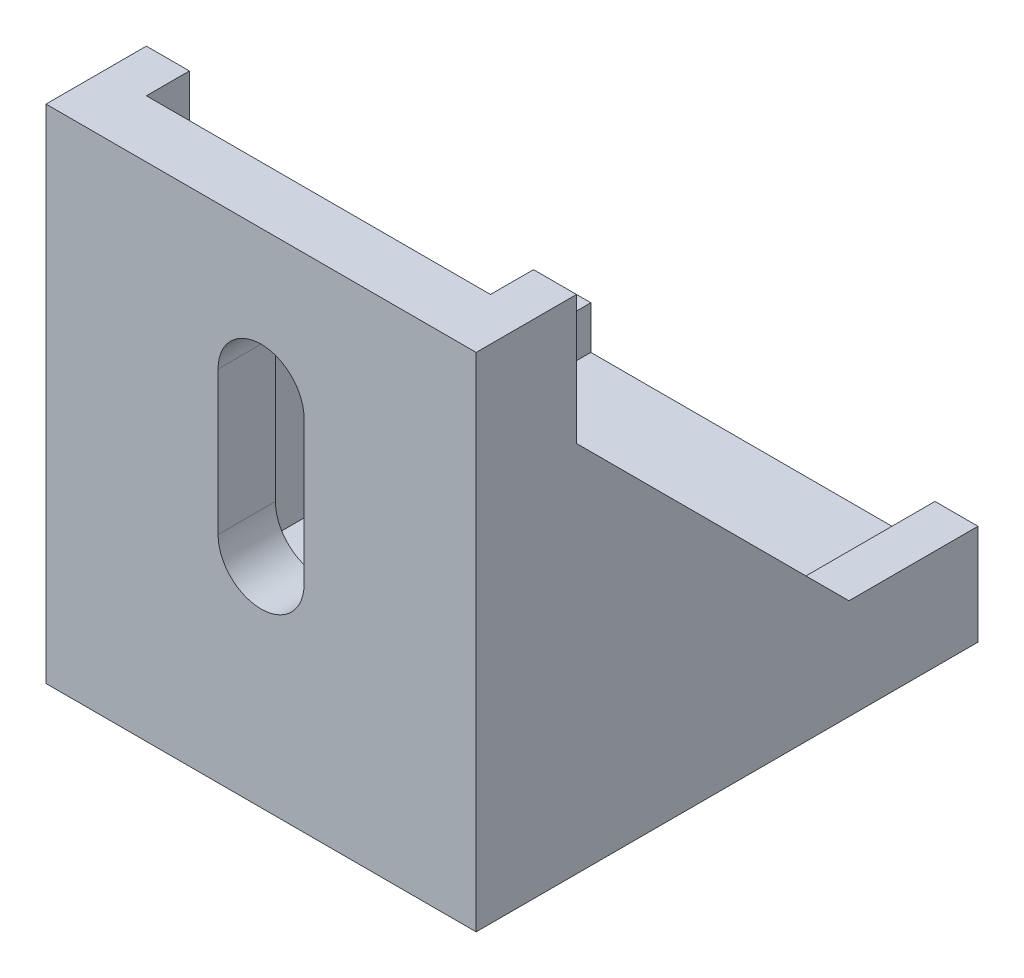
ISO-10303-21;
HEADER;
FILE_DESCRIPTION(('STEP AP214'),'2;1');
FILE_NAME('part.step','',(''),(''),'','','');
FILE_SCHEMA(('AUTOMOTIVE_DESIGN { 1 0 10303 214 1 1 1 1 }'));
ENDSEC;
DATA;
#1=APPLICATION_CONTEXT('core data for automotive mechanical design processes');
#2=APPLICATION_PROTOCOL_DEFINITION('international standard','automotive_design',2000,#1);
#3=PRODUCT_CONTEXT('',#1,'mechanical');
#4=PRODUCT('Part','Part','',(#3));
#5=PRODUCT_RELATED_PRODUCT_CATEGORY('part','',(#4));
#6=PRODUCT_DEFINITION_FORMATION('','',#4);
#7=PRODUCT_DEFINITION_CONTEXT('part definition',#1,'design');
#8=PRODUCT_DEFINITION('design','',#6,#7);
#9=PRODUCT_DEFINITION_SHAPE('','',#8);
#10=(LENGTH_UNIT() NAMED_UNIT(*) SI_UNIT(.MILLI.,.METRE.));
#11=(NAMED_UNIT(*) PLANE_ANGLE_UNIT() SI_UNIT($,.RADIAN.));
#12=(NAMED_UNIT(*) SI_UNIT($,.STERADIAN.) SOLID_ANGLE_UNIT());
#13=UNCERTAINTY_MEASURE_WITH_UNIT(LENGTH_MEASURE(1.E-05),#10,'distance_accuracy_value','');
#14=(GEOMETRIC_REPRESENTATION_CONTEXT(3) GLOBAL_UNCERTAINTY_ASSIGNED_CONTEXT((#13)) GLOBAL_UNIT_ASSIGNED_CONTEXT((#10,
#11,#12)) REPRESENTATION_CONTEXT('',''));
#15=CARTESIAN_POINT('',(0.,0.,0.));
#16=DIRECTION('',(0.,0.,1.));
#17=DIRECTION('',(1.,0.,0.));
#18=AXIS2_PLACEMENT_3D('',#15,#16,#17);
#19=CARTESIAN_POINT('',(30.,4.,-35.));
#20=DIRECTION('',(0.,-1.,0.));
#21=DIRECTION('',(0.,0.,-1.));
#22=AXIS2_PLACEMENT_3D('',#19,#20,#21);
#23=PLANE('',#22);
#24=DIRECTION('',(0.,0.,-1.));
#25=VECTOR('',#24,1.);
#26=CARTESIAN_POINT('',(12.,4.,-35.));
#27=LINE('',#26,#25);
#28=CARTESIAN_POINT('',(12.,4.,-12.5));
#29=VERTEX_POINT('',#28);
#30=CARTESIAN_POINT('',(12.,4.,-22.5));
#31=VERTEX_POINT('',#30);
#32=EDGE_CURVE('E231',#29,#31,#27,.T.);
#33=ORIENTED_EDGE('',*,*,#32,.T.);
#34=CARTESIAN_POINT('',(15.,4.,-22.5));
#35=DIRECTION('',(0.,-1.,0.));
#36=DIRECTION('',(0.,0.,-1.));
#37=AXIS2_PLACEMENT_3D('',#34,#35,#36);
#38=CIRCLE('',#37,3.);
#39=CARTESIAN_POINT('',(18.,4.,-22.5));
#40=VERTEX_POINT('',#39);
#41=EDGE_CURVE('E234',#31,#40,#38,.T.);
#42=ORIENTED_EDGE('',*,*,#41,.T.);
#43=DIRECTION('',(0.,0.,1.));
#44=VECTOR('',#43,1.);
#45=CARTESIAN_POINT('',(18.,4.,-35.));
#46=LINE('',#45,#44);
#47=CARTESIAN_POINT('',(18.,4.,-12.5));
#48=VERTEX_POINT('',#47);
#49=EDGE_CURVE('E226',#40,#48,#46,.T.);
#50=ORIENTED_EDGE('',*,*,#49,.T.);
#51=CARTESIAN_POINT('',(15.,4.,-12.5));
#52=DIRECTION('',(0.,-1.,0.));
#53=DIRECTION('',(0.,0.,-1.));
#54=AXIS2_PLACEMENT_3D('',#51,#52,#53);
#55=CIRCLE('',#54,3.);
#56=EDGE_CURVE('E206',#48,#29,#55,.T.);
#57=ORIENTED_EDGE('',*,*,#56,.T.);
#58=EDGE_LOOP('',(#33,#42,#50,#57));
#59=FACE_BOUND('',#58,.T.);
#60=DIRECTION('',(0.,0.,1.));
#61=VECTOR('',#60,1.);
#62=CARTESIAN_POINT('',(27.,4.,-4.));
#63=LINE('',#62,#61);
#64=CARTESIAN_POINT('',(27.,4.,-35.));
#65=VERTEX_POINT('',#64);
#66=CARTESIAN_POINT('',(27.,4.,-4.));
#67=VERTEX_POINT('',#66);
#68=EDGE_CURVE('E304',#65,#67,#63,.T.);
#69=ORIENTED_EDGE('',*,*,#68,.F.);
#70=DIRECTION('',(-1.,0.,0.));
#71=VECTOR('',#70,1.);
#72=CARTESIAN_POINT('',(30.,4.,-35.));
#73=LINE('',#72,#71);
#74=CARTESIAN_POINT('',(3.,4.,-35.));
#75=VERTEX_POINT('',#74);
#76=EDGE_CURVE('E358',#65,#75,#73,.T.);
#77=ORIENTED_EDGE('',*,*,#76,.T.);
#78=DIRECTION('',(0.,0.,-1.));
#79=VECTOR('',#78,1.);
#80=CARTESIAN_POINT('',(3.,4.,-4.));
#81=LINE('',#80,#79);
#82=CARTESIAN_POINT('',(3.,4.,-4.));
#83=VERTEX_POINT('',#82);
#84=EDGE_CURVE('E11',#83,#75,#81,.T.);
#85=ORIENTED_EDGE('',*,*,#84,.F.);
#86=DIRECTION('',(-1.,0.,0.));
#87=VECTOR('',#86,1.);
#88=CARTESIAN_POINT('',(30.,4.,-4.));
#89=LINE('',#88,#87);
#90=EDGE_CURVE('E354',#67,#83,#89,.T.);
#91=ORIENTED_EDGE('',*,*,#90,.F.);
#92=EDGE_LOOP('',(#69,#77,#85,#91));
#93=FACE_BOUND('',#92,.T.);
#94=ADVANCED_FACE('F38',(#59,#93),#23,.F.);
#95=CARTESIAN_POINT('',(3.,4.,-29.));
#96=DIRECTION('',(0.,-0.707106781186548,0.707106781186548));
#97=DIRECTION('',(0.,-0.707106781186548,-0.707106781186548));
#98=AXIS2_PLACEMENT_3D('',#95,#96,#97);
#99=PLANE('',#98);
#100=DIRECTION('',(0.,0.707106781186547,0.707106781186547));
#101=VECTOR('',#100,1.);
#102=CARTESIAN_POINT('',(3.,4.,-29.));
#103=LINE('',#102,#101);
#104=CARTESIAN_POINT('',(3.,7.,-26.));
#105=VERTEX_POINT('',#104);
#106=CARTESIAN_POINT('',(3.,26.,-7.00000000000001));
#107=VERTEX_POINT('',#106);
#108=EDGE_CURVE('E394',#105,#107,#103,.T.);
#109=ORIENTED_EDGE('',*,*,#108,.F.);
#110=DIRECTION('',(-1.,0.,0.));
#111=VECTOR('',#110,1.);
#112=CARTESIAN_POINT('',(3.,7.,-26.));
#113=LINE('',#112,#111);
#114=CARTESIAN_POINT('',(0.,7.,-26.));
#115=VERTEX_POINT('',#114);
#116=EDGE_CURVE('E292',#105,#115,#113,.T.);
#117=ORIENTED_EDGE('',*,*,#116,.T.);
#118=DIRECTION('',(0.,0.707106781186547,0.707106781186547));
#119=VECTOR('',#118,1.);
#120=CARTESIAN_POINT('',(0.,4.,-29.));
#121=LINE('',#120,#119);
#122=CARTESIAN_POINT('',(0.,26.,-7.));
#123=VERTEX_POINT('',#122);
#124=EDGE_CURVE('E42',#115,#123,#121,.T.);
#125=ORIENTED_EDGE('',*,*,#124,.T.);
#126=DIRECTION('',(-1.,0.,0.));
#127=VECTOR('',#126,1.);
#128=CARTESIAN_POINT('',(3.,26.,-7.));
#129=LINE('',#128,#127);
#130=EDGE_CURVE('E388',#107,#123,#129,.T.);
#131=ORIENTED_EDGE('',*,*,#130,.F.);
#132=EDGE_LOOP('',(#109,#117,#125,#131));
#133=FACE_BOUND('',#132,.T.);
#134=ADVANCED_FACE('F40',(#133),#99,.F.);
#135=CARTESIAN_POINT('',(3.,0.,0.));
#136=DIRECTION('',(-1.,0.,0.));
#137=DIRECTION('',(0.,0.,1.));
#138=AXIS2_PLACEMENT_3D('',#135,#136,#137);
#139=PLANE('',#138);
#140=ORIENTED_EDGE('',*,*,#84,.T.);
#141=DIRECTION('',(0.,-1.,0.));
#142=VECTOR('',#141,1.);
#143=CARTESIAN_POINT('',(3.,4.,-35.));
#144=LINE('',#143,#142);
#145=CARTESIAN_POINT('',(3.,7.,-35.));
#146=VERTEX_POINT('',#145);
#147=EDGE_CURVE('E289',#146,#75,#144,.T.);
#148=ORIENTED_EDGE('',*,*,#147,.F.);
#149=DIRECTION('',(0.,0.,-1.));
#150=VECTOR('',#149,1.);
#151=CARTESIAN_POINT('',(3.,7.,-35.));
#152=LINE('',#151,#150);
#153=EDGE_CURVE('E286',#105,#146,#152,.T.);
#154=ORIENTED_EDGE('',*,*,#153,.F.);
#155=ORIENTED_EDGE('',*,*,#108,.T.);
#156=DIRECTION('',(0.,-1.,0.));
#157=VECTOR('',#156,1.);
#158=CARTESIAN_POINT('',(3.,35.,-7.));
#159=LINE('',#158,#157);
#160=CARTESIAN_POINT('',(3.,35.,-7.));
#161=VERTEX_POINT('',#160);
#162=EDGE_CURVE('E376',#161,#107,#159,.T.);
#163=ORIENTED_EDGE('',*,*,#162,.F.);
#164=DIRECTION('',(0.,0.,-1.));
#165=VECTOR('',#164,1.);
#166=CARTESIAN_POINT('',(3.,35.,-4.));
#167=LINE('',#166,#165);
#168=CARTESIAN_POINT('',(3.,35.,-4.));
#169=VERTEX_POINT('',#168);
#170=EDGE_CURVE('E372',#169,#161,#167,.T.);
#171=ORIENTED_EDGE('',*,*,#170,.F.);
#172=DIRECTION('',(0.,-1.,0.));
#173=VECTOR('',#172,1.);
#174=CARTESIAN_POINT('',(3.,4.,-4.));
#175=LINE('',#174,#173);
#176=EDGE_CURVE('E48',#169,#83,#175,.T.);
#177=ORIENTED_EDGE('',*,*,#176,.T.);
#178=EDGE_LOOP('',(#140,#148,#154,#155,#163,#171,#177));
#179=FACE_BOUND('',#178,.T.);
#180=ADVANCED_FACE('F401',(#179),#139,.F.);
#181=CARTESIAN_POINT('',(0.,0.,0.));
#182=DIRECTION('',(-1.,0.,0.));
#183=DIRECTION('',(0.,0.,1.));
#184=AXIS2_PLACEMENT_3D('',#181,#182,#183);
#185=PLANE('',#184);
#186=ORIENTED_EDGE('',*,*,#124,.F.);
#187=DIRECTION('',(0.,0.,-1.));
#188=VECTOR('',#187,1.);
#189=CARTESIAN_POINT('',(0.,7.,-35.));
#190=LINE('',#189,#188);
#191=CARTESIAN_POINT('',(0.,7.,-35.));
#192=VERTEX_POINT('',#191);
#193=EDGE_CURVE('E283',#115,#192,#190,.T.);
#194=ORIENTED_EDGE('',*,*,#193,.T.);
#195=DIRECTION('',(0.,1.,0.));
#196=VECTOR('',#195,1.);
#197=CARTESIAN_POINT('',(0.,0.,-35.));
#198=LINE('',#197,#196);
#199=CARTESIAN_POINT('',(0.,0.,-35.));
#200=VERTEX_POINT('',#199);
#201=EDGE_CURVE('E337',#200,#192,#198,.T.);
#202=ORIENTED_EDGE('',*,*,#201,.F.);
#203=DIRECTION('',(0.,0.,-1.));
#204=VECTOR('',#203,1.);
#205=CARTESIAN_POINT('',(0.,0.,0.));
#206=LINE('',#205,#204);
#207=CARTESIAN_POINT('',(0.,0.,0.));
#208=VERTEX_POINT('',#207);
#209=EDGE_CURVE('E347',#208,#200,#206,.T.);
#210=ORIENTED_EDGE('',*,*,#209,.F.);
#211=DIRECTION('',(0.,-1.,0.));
#212=VECTOR('',#211,1.);
#213=CARTESIAN_POINT('',(0.,35.,0.));
#214=LINE('',#213,#212);
#215=CARTESIAN_POINT('',(0.,35.,0.));
#216=VERTEX_POINT('',#215);
#217=EDGE_CURVE('E329',#216,#208,#214,.T.);
#218=ORIENTED_EDGE('',*,*,#217,.F.);
#219=DIRECTION('',(0.,0.,-1.));
#220=VECTOR('',#219,1.);
#221=CARTESIAN_POINT('',(0.,35.,-4.));
#222=LINE('',#221,#220);
#223=CARTESIAN_POINT('',(0.,35.,-7.));
#224=VERTEX_POINT('',#223);
#225=EDGE_CURVE('E371',#216,#224,#222,.T.);
#226=ORIENTED_EDGE('',*,*,#225,.T.);
#227=DIRECTION('',(0.,-1.,0.));
#228=VECTOR('',#227,1.);
#229=CARTESIAN_POINT('',(0.,35.,-7.));
#230=LINE('',#229,#228);
#231=EDGE_CURVE('E377',#224,#123,#230,.T.);
#232=ORIENTED_EDGE('',*,*,#231,.T.);
#233=EDGE_LOOP('',(#186,#194,#202,#210,#218,#226,#232));
#234=FACE_BOUND('',#233,.T.);
#235=ADVANCED_FACE('F438',(#234),#185,.T.);
#236=CARTESIAN_POINT('',(3.,35.,-7.));
#237=DIRECTION('',(0.,0.,-1.));
#238=DIRECTION('',(0.,1.,0.));
#239=AXIS2_PLACEMENT_3D('',#236,#237,#238);
#240=PLANE('',#239);
#241=ORIENTED_EDGE('',*,*,#231,.F.);
#242=DIRECTION('',(-1.,0.,0.));
#243=VECTOR('',#242,1.);
#244=CARTESIAN_POINT('',(3.,35.,-7.));
#245=LINE('',#244,#243);
#246=EDGE_CURVE('E381',#161,#224,#245,.T.);
#247=ORIENTED_EDGE('',*,*,#246,.F.);
#248=ORIENTED_EDGE('',*,*,#162,.T.);
#249=ORIENTED_EDGE('',*,*,#130,.T.);
#250=EDGE_LOOP('',(#241,#247,#248,#249));
#251=FACE_BOUND('',#250,.T.);
#252=ADVANCED_FACE('F444',(#251),#240,.T.);
#253=CARTESIAN_POINT('',(3.,35.,-4.));
#254=DIRECTION('',(0.,1.,0.));
#255=DIRECTION('',(0.,0.,1.));
#256=AXIS2_PLACEMENT_3D('',#253,#254,#255);
#257=PLANE('',#256);
#258=ORIENTED_EDGE('',*,*,#225,.F.);
#259=DIRECTION('',(-1.,0.,0.));
#260=VECTOR('',#259,1.);
#261=CARTESIAN_POINT('',(30.,35.,0.));
#262=LINE('',#261,#260);
#263=CARTESIAN_POINT('',(30.,35.,0.));
#264=VERTEX_POINT('',#263);
#265=EDGE_CURVE('E367',#264,#216,#262,.T.);
#266=ORIENTED_EDGE('',*,*,#265,.F.);
#267=DIRECTION('',(0.,0.,1.));
#268=VECTOR('',#267,1.);
#269=CARTESIAN_POINT('',(30.,35.,-4.));
#270=LINE('',#269,#268);
#271=CARTESIAN_POINT('',(30.,35.,-7.));
#272=VERTEX_POINT('',#271);
#273=EDGE_CURVE('E333',#272,#264,#270,.T.);
#274=ORIENTED_EDGE('',*,*,#273,.F.);
#275=DIRECTION('',(1.,0.,0.));
#276=VECTOR('',#275,1.);
#277=CARTESIAN_POINT('',(27.,35.,-7.));
#278=LINE('',#277,#276);
#279=CARTESIAN_POINT('',(27.,35.,-7.));
#280=VERTEX_POINT('',#279);
#281=EDGE_CURVE('E325',#280,#272,#278,.T.);
#282=ORIENTED_EDGE('',*,*,#281,.F.);
#283=DIRECTION('',(0.,0.,1.));
#284=VECTOR('',#283,1.);
#285=CARTESIAN_POINT('',(27.,35.,-4.));
#286=LINE('',#285,#284);
#287=CARTESIAN_POINT('',(27.,35.,-4.));
#288=VERTEX_POINT('',#287);
#289=EDGE_CURVE('E317',#280,#288,#286,.T.);
#290=ORIENTED_EDGE('',*,*,#289,.T.);
#291=DIRECTION('',(-1.,0.,0.));
#292=VECTOR('',#291,1.);
#293=CARTESIAN_POINT('',(30.,35.,-4.));
#294=LINE('',#293,#292);
#295=EDGE_CURVE('E344',#288,#169,#294,.T.);
#296=ORIENTED_EDGE('',*,*,#295,.T.);
#297=ORIENTED_EDGE('',*,*,#170,.T.);
#298=ORIENTED_EDGE('',*,*,#246,.T.);
#299=EDGE_LOOP('',(#258,#266,#274,#282,#290,#296,#297,#298));
#300=FACE_BOUND('',#299,.T.);
#301=ADVANCED_FACE('F415',(#300),#257,.T.);
#302=CARTESIAN_POINT('',(30.,4.,-4.));
#303=DIRECTION('',(0.,0.,1.));
#304=DIRECTION('',(1.,0.,0.));
#305=AXIS2_PLACEMENT_3D('',#302,#303,#304);
#306=PLANE('',#305);
#307=DIRECTION('',(0.,-1.,0.));
#308=VECTOR('',#307,1.);
#309=CARTESIAN_POINT('',(12.,4.,-4.));
#310=LINE('',#309,#308);
#311=CARTESIAN_POINT('',(12.,25.,-4.));
#312=VERTEX_POINT('',#311);
#313=CARTESIAN_POINT('',(12.,15.,-4.));
#314=VERTEX_POINT('',#313);
#315=EDGE_CURVE('E264',#312,#314,#310,.T.);
#316=ORIENTED_EDGE('',*,*,#315,.T.);
#317=CARTESIAN_POINT('',(15.,15.,-4.));
#318=DIRECTION('',(0.,0.,1.));
#319=DIRECTION('',(1.,0.,0.));
#320=AXIS2_PLACEMENT_3D('',#317,#318,#319);
#321=CIRCLE('',#320,3.);
#322=CARTESIAN_POINT('',(18.,15.,-4.));
#323=VERTEX_POINT('',#322);
#324=EDGE_CURVE('E267',#314,#323,#321,.T.);
#325=ORIENTED_EDGE('',*,*,#324,.T.);
#326=DIRECTION('',(0.,1.,0.));
#327=VECTOR('',#326,1.);
#328=CARTESIAN_POINT('',(18.,3.99999999999999,-4.));
#329=LINE('',#328,#327);
#330=CARTESIAN_POINT('',(18.,25.,-4.));
#331=VERTEX_POINT('',#330);
#332=EDGE_CURVE('E252',#323,#331,#329,.T.);
#333=ORIENTED_EDGE('',*,*,#332,.T.);
#334=CARTESIAN_POINT('',(15.,25.,-4.));
#335=DIRECTION('',(0.,0.,1.));
#336=DIRECTION('',(1.,0.,0.));
#337=AXIS2_PLACEMENT_3D('',#334,#335,#336);
#338=CIRCLE('',#337,3.);
#339=EDGE_CURVE('E261',#331,#312,#338,.T.);
#340=ORIENTED_EDGE('',*,*,#339,.T.);
#341=EDGE_LOOP('',(#316,#325,#333,#340));
#342=FACE_BOUND('',#341,.T.);
#343=ORIENTED_EDGE('',*,*,#90,.T.);
#344=ORIENTED_EDGE('',*,*,#176,.F.);
#345=ORIENTED_EDGE('',*,*,#295,.F.);
#346=DIRECTION('',(0.,-1.,0.));
#347=VECTOR('',#346,1.);
#348=CARTESIAN_POINT('',(27.,29.,-4.));
#349=LINE('',#348,#347);
#350=EDGE_CURVE('E310',#288,#67,#349,.T.);
#351=ORIENTED_EDGE('',*,*,#350,.T.);
#352=EDGE_LOOP('',(#343,#344,#345,#351));
#353=FACE_BOUND('',#352,.T.);
#354=ADVANCED_FACE('F409',(#342,#353),#306,.F.);
#355=CARTESIAN_POINT('',(30.,35.,0.));
#356=DIRECTION('',(0.,0.,-1.));
#357=DIRECTION('',(0.,1.,0.));
#358=AXIS2_PLACEMENT_3D('',#355,#356,#357);
#359=PLANE('',#358);
#360=DIRECTION('',(0.,1.,0.));
#361=VECTOR('',#360,1.);
#362=CARTESIAN_POINT('',(18.,15.,0.));
#363=LINE('',#362,#361);
#364=CARTESIAN_POINT('',(18.,15.,0.));
#365=VERTEX_POINT('',#364);
#366=CARTESIAN_POINT('',(18.,25.,0.));
#367=VERTEX_POINT('',#366);
#368=EDGE_CURVE('E239',#365,#367,#363,.T.);
#369=ORIENTED_EDGE('',*,*,#368,.F.);
#370=CARTESIAN_POINT('',(15.,15.,0.));
#371=DIRECTION('',(0.,0.,1.));
#372=DIRECTION('',(1.,0.,0.));
#373=AXIS2_PLACEMENT_3D('',#370,#371,#372);
#374=CIRCLE('',#373,3.);
#375=CARTESIAN_POINT('',(12.,15.,0.));
#376=VERTEX_POINT('',#375);
#377=EDGE_CURVE('E237',#376,#365,#374,.T.);
#378=ORIENTED_EDGE('',*,*,#377,.F.);
#379=DIRECTION('',(0.,-1.,0.));
#380=VECTOR('',#379,1.);
#381=CARTESIAN_POINT('',(12.,15.,0.));
#382=LINE('',#381,#380);
#383=CARTESIAN_POINT('',(12.,25.,0.));
#384=VERTEX_POINT('',#383);
#385=EDGE_CURVE('E245',#384,#376,#382,.T.);
#386=ORIENTED_EDGE('',*,*,#385,.F.);
#387=CARTESIAN_POINT('',(15.,25.,0.));
#388=DIRECTION('',(0.,0.,1.));
#389=DIRECTION('',(1.,0.,0.));
#390=AXIS2_PLACEMENT_3D('',#387,#388,#389);
#391=CIRCLE('',#390,3.);
#392=EDGE_CURVE('E242',#367,#384,#391,.T.);
#393=ORIENTED_EDGE('',*,*,#392,.F.);
#394=EDGE_LOOP('',(#369,#378,#386,#393));
#395=FACE_BOUND('',#394,.T.);
#396=ORIENTED_EDGE('',*,*,#217,.T.);
#397=DIRECTION('',(-1.,0.,0.));
#398=VECTOR('',#397,1.);
#399=CARTESIAN_POINT('',(30.,0.,0.));
#400=LINE('',#399,#398);
#401=CARTESIAN_POINT('',(30.,0.,0.));
#402=VERTEX_POINT('',#401);
#403=EDGE_CURVE('E363',#402,#208,#400,.T.);
#404=ORIENTED_EDGE('',*,*,#403,.F.);
#405=DIRECTION('',(0.,-1.,0.));
#406=VECTOR('',#405,1.);
#407=CARTESIAN_POINT('',(30.,35.,0.));
#408=LINE('',#407,#406);
#409=EDGE_CURVE('E336',#264,#402,#408,.T.);
#410=ORIENTED_EDGE('',*,*,#409,.F.);
#411=ORIENTED_EDGE('',*,*,#265,.T.);
#412=EDGE_LOOP('',(#396,#404,#410,#411));
#413=FACE_BOUND('',#412,.T.);
#414=ADVANCED_FACE('F448',(#395,#413),#359,.F.);
#415=CARTESIAN_POINT('',(30.,0.,0.));
#416=DIRECTION('',(0.,1.,0.));
#417=DIRECTION('',(0.,0.,1.));
#418=AXIS2_PLACEMENT_3D('',#415,#416,#417);
#419=PLANE('',#418);
#420=DIRECTION('',(0.,0.,1.));
#421=VECTOR('',#420,1.);
#422=CARTESIAN_POINT('',(18.,0.,-22.5));
#423=LINE('',#422,#421);
#424=CARTESIAN_POINT('',(18.,0.,-22.5));
#425=VERTEX_POINT('',#424);
#426=CARTESIAN_POINT('',(18.,0.,-12.5));
#427=VERTEX_POINT('',#426);
#428=EDGE_CURVE('E212',#425,#427,#423,.T.);
#429=ORIENTED_EDGE('',*,*,#428,.F.);
#430=CARTESIAN_POINT('',(15.,0.,-22.5));
#431=DIRECTION('',(0.,-1.,0.));
#432=DIRECTION('',(0.,0.,-1.));
#433=AXIS2_PLACEMENT_3D('',#430,#431,#432);
#434=CIRCLE('',#433,3.);
#435=CARTESIAN_POINT('',(12.,0.,-22.5));
#436=VERTEX_POINT('',#435);
#437=EDGE_CURVE('E63',#436,#425,#434,.T.);
#438=ORIENTED_EDGE('',*,*,#437,.F.);
#439=DIRECTION('',(0.,0.,-1.));
#440=VECTOR('',#439,1.);
#441=CARTESIAN_POINT('',(12.,0.,-22.5));
#442=LINE('',#441,#440);
#443=CARTESIAN_POINT('',(12.,0.,-12.5));
#444=VERTEX_POINT('',#443);
#445=EDGE_CURVE('E219',#444,#436,#442,.T.);
#446=ORIENTED_EDGE('',*,*,#445,.F.);
#447=CARTESIAN_POINT('',(15.,0.,-12.5));
#448=DIRECTION('',(0.,-1.,0.));
#449=DIRECTION('',(0.,0.,-1.));
#450=AXIS2_PLACEMENT_3D('',#447,#448,#449);
#451=CIRCLE('',#450,3.);
#452=EDGE_CURVE('E203',#427,#444,#451,.T.);
#453=ORIENTED_EDGE('',*,*,#452,.F.);
#454=EDGE_LOOP('',(#429,#438,#446,#453));
#455=FACE_BOUND('',#454,.T.);
#456=ORIENTED_EDGE('',*,*,#209,.T.);
#457=DIRECTION('',(-1.,0.,0.));
#458=VECTOR('',#457,1.);
#459=CARTESIAN_POINT('',(30.,0.,-35.));
#460=LINE('',#459,#458);
#461=CARTESIAN_POINT('',(30.,0.,-35.));
#462=VERTEX_POINT('',#461);
#463=EDGE_CURVE('E360',#462,#200,#460,.T.);
#464=ORIENTED_EDGE('',*,*,#463,.F.);
#465=DIRECTION('',(0.,0.,-1.));
#466=VECTOR('',#465,1.);
#467=CARTESIAN_POINT('',(30.,0.,0.));
#468=LINE('',#467,#466);
#469=EDGE_CURVE('E340',#402,#462,#468,.T.);
#470=ORIENTED_EDGE('',*,*,#469,.F.);
#471=ORIENTED_EDGE('',*,*,#403,.T.);
#472=EDGE_LOOP('',(#456,#464,#470,#471));
#473=FACE_BOUND('',#472,.T.);
#474=ADVANCED_FACE('F216',(#455,#473),#419,.F.);
#475=CARTESIAN_POINT('',(30.,0.,-35.));
#476=DIRECTION('',(0.,0.,1.));
#477=DIRECTION('',(1.,0.,0.));
#478=AXIS2_PLACEMENT_3D('',#475,#476,#477);
#479=PLANE('',#478);
#480=ORIENTED_EDGE('',*,*,#201,.T.);
#481=DIRECTION('',(-1.,0.,0.));
#482=VECTOR('',#481,1.);
#483=CARTESIAN_POINT('',(3.,7.,-35.));
#484=LINE('',#483,#482);
#485=EDGE_CURVE('E295',#146,#192,#484,.T.);
#486=ORIENTED_EDGE('',*,*,#485,.F.);
#487=ORIENTED_EDGE('',*,*,#147,.T.);
#488=ORIENTED_EDGE('',*,*,#76,.F.);
#489=DIRECTION('',(0.,1.,0.));
#490=VECTOR('',#489,1.);
#491=CARTESIAN_POINT('',(27.,4.,-35.));
#492=LINE('',#491,#490);
#493=CARTESIAN_POINT('',(27.,7.,-35.));
#494=VERTEX_POINT('',#493);
#495=EDGE_CURVE('E271',#65,#494,#492,.T.);
#496=ORIENTED_EDGE('',*,*,#495,.T.);
#497=DIRECTION('',(1.,0.,0.));
#498=VECTOR('',#497,1.);
#499=CARTESIAN_POINT('',(27.,7.,-35.));
#500=LINE('',#499,#498);
#501=CARTESIAN_POINT('',(30.,7.,-35.));
#502=VERTEX_POINT('',#501);
#503=EDGE_CURVE('E277',#494,#502,#500,.T.);
#504=ORIENTED_EDGE('',*,*,#503,.T.);
#505=DIRECTION('',(0.,1.,0.));
#506=VECTOR('',#505,1.);
#507=CARTESIAN_POINT('',(30.,0.,-35.));
#508=LINE('',#507,#506);
#509=EDGE_CURVE('E342',#462,#502,#508,.T.);
#510=ORIENTED_EDGE('',*,*,#509,.F.);
#511=ORIENTED_EDGE('',*,*,#463,.T.);
#512=EDGE_LOOP('',(#480,#486,#487,#488,#496,#504,#510,#511));
#513=FACE_BOUND('',#512,.T.);
#514=ADVANCED_FACE('F428',(#513),#479,.F.);
#515=CARTESIAN_POINT('',(30.,0.,0.));
#516=DIRECTION('',(1.,0.,0.));
#517=DIRECTION('',(0.,0.,-1.));
#518=AXIS2_PLACEMENT_3D('',#515,#516,#517);
#519=PLANE('',#518);
#520=ORIENTED_EDGE('',*,*,#273,.T.);
#521=ORIENTED_EDGE('',*,*,#409,.T.);
#522=ORIENTED_EDGE('',*,*,#469,.T.);
#523=ORIENTED_EDGE('',*,*,#509,.T.);
#524=DIRECTION('',(0.,0.,1.));
#525=VECTOR('',#524,1.);
#526=CARTESIAN_POINT('',(30.,7.,-35.));
#527=LINE('',#526,#525);
#528=CARTESIAN_POINT('',(30.,7.,-26.));
#529=VERTEX_POINT('',#528);
#530=EDGE_CURVE('E270',#502,#529,#527,.T.);
#531=ORIENTED_EDGE('',*,*,#530,.T.);
#532=DIRECTION('',(0.,-0.707106781186547,-0.707106781186547));
#533=VECTOR('',#532,1.);
#534=CARTESIAN_POINT('',(30.,29.,-4.));
#535=LINE('',#534,#533);
#536=CARTESIAN_POINT('',(30.,26.,-7.));
#537=VERTEX_POINT('',#536);
#538=EDGE_CURVE('E298',#537,#529,#535,.T.);
#539=ORIENTED_EDGE('',*,*,#538,.F.);
#540=DIRECTION('',(0.,1.,0.));
#541=VECTOR('',#540,1.);
#542=CARTESIAN_POINT('',(30.,35.,-7.));
#543=LINE('',#542,#541);
#544=EDGE_CURVE('E307',#537,#272,#543,.T.);
#545=ORIENTED_EDGE('',*,*,#544,.T.);
#546=EDGE_LOOP('',(#520,#521,#522,#523,#531,#539,#545));
#547=FACE_BOUND('',#546,.T.);
#548=ADVANCED_FACE('F451',(#547),#519,.T.);
#549=CARTESIAN_POINT('',(27.,35.,-7.));
#550=DIRECTION('',(0.,0.,-1.));
#551=DIRECTION('',(0.,1.,0.));
#552=AXIS2_PLACEMENT_3D('',#549,#550,#551);
#553=PLANE('',#552);
#554=ORIENTED_EDGE('',*,*,#544,.F.);
#555=DIRECTION('',(1.,0.,0.));
#556=VECTOR('',#555,1.);
#557=CARTESIAN_POINT('',(27.,26.,-7.));
#558=LINE('',#557,#556);
#559=CARTESIAN_POINT('',(27.,26.,-7.));
#560=VERTEX_POINT('',#559);
#561=EDGE_CURVE('E321',#560,#537,#558,.T.);
#562=ORIENTED_EDGE('',*,*,#561,.F.);
#563=DIRECTION('',(0.,1.,0.));
#564=VECTOR('',#563,1.);
#565=CARTESIAN_POINT('',(27.,35.,-7.));
#566=LINE('',#565,#564);
#567=EDGE_CURVE('E313',#560,#280,#566,.T.);
#568=ORIENTED_EDGE('',*,*,#567,.T.);
#569=ORIENTED_EDGE('',*,*,#281,.T.);
#570=EDGE_LOOP('',(#554,#562,#568,#569));
#571=FACE_BOUND('',#570,.T.);
#572=ADVANCED_FACE('F419',(#571),#553,.T.);
#573=CARTESIAN_POINT('',(27.,0.,0.));
#574=DIRECTION('',(-1.,0.,0.));
#575=DIRECTION('',(0.,0.,1.));
#576=AXIS2_PLACEMENT_3D('',#573,#574,#575);
#577=PLANE('',#576);
#578=ORIENTED_EDGE('',*,*,#350,.F.);
#579=ORIENTED_EDGE('',*,*,#289,.F.);
#580=ORIENTED_EDGE('',*,*,#567,.F.);
#581=DIRECTION('',(0.,-0.707106781186547,-0.707106781186547));
#582=VECTOR('',#581,1.);
#583=CARTESIAN_POINT('',(27.,29.,-4.));
#584=LINE('',#583,#582);
#585=CARTESIAN_POINT('',(27.,7.,-26.));
#586=VERTEX_POINT('',#585);
#587=EDGE_CURVE('E300',#560,#586,#584,.T.);
#588=ORIENTED_EDGE('',*,*,#587,.T.);
#589=DIRECTION('',(0.,0.,1.));
#590=VECTOR('',#589,1.);
#591=CARTESIAN_POINT('',(27.,7.,-35.));
#592=LINE('',#591,#590);
#593=EDGE_CURVE('E274',#494,#586,#592,.T.);
#594=ORIENTED_EDGE('',*,*,#593,.F.);
#595=ORIENTED_EDGE('',*,*,#495,.F.);
#596=ORIENTED_EDGE('',*,*,#68,.T.);
#597=EDGE_LOOP('',(#578,#579,#580,#588,#594,#595,#596));
#598=FACE_BOUND('',#597,.T.);
#599=ADVANCED_FACE('F412',(#598),#577,.T.);
#600=CARTESIAN_POINT('',(27.,29.,-4.));
#601=DIRECTION('',(0.,-0.707106781186548,0.707106781186548));
#602=DIRECTION('',(0.,-0.707106781186548,-0.707106781186548));
#603=AXIS2_PLACEMENT_3D('',#600,#601,#602);
#604=PLANE('',#603);
#605=ORIENTED_EDGE('',*,*,#538,.T.);
#606=DIRECTION('',(1.,0.,0.));
#607=VECTOR('',#606,1.);
#608=CARTESIAN_POINT('',(27.,7.,-26.));
#609=LINE('',#608,#607);
#610=EDGE_CURVE('E280',#586,#529,#609,.T.);
#611=ORIENTED_EDGE('',*,*,#610,.F.);
#612=ORIENTED_EDGE('',*,*,#587,.F.);
#613=ORIENTED_EDGE('',*,*,#561,.T.);
#614=EDGE_LOOP('',(#605,#611,#612,#613));
#615=FACE_BOUND('',#614,.T.);
#616=ADVANCED_FACE('F453',(#615),#604,.F.);
#617=CARTESIAN_POINT('',(3.,7.,-35.));
#618=DIRECTION('',(0.,1.,0.));
#619=DIRECTION('',(0.,0.,1.));
#620=AXIS2_PLACEMENT_3D('',#617,#618,#619);
#621=PLANE('',#620);
#622=ORIENTED_EDGE('',*,*,#193,.F.);
#623=ORIENTED_EDGE('',*,*,#116,.F.);
#624=ORIENTED_EDGE('',*,*,#153,.T.);
#625=ORIENTED_EDGE('',*,*,#485,.T.);
#626=EDGE_LOOP('',(#622,#623,#624,#625));
#627=FACE_BOUND('',#626,.T.);
#628=ADVANCED_FACE('F434',(#627),#621,.T.);
#629=CARTESIAN_POINT('',(27.,7.,-35.));
#630=DIRECTION('',(0.,1.,0.));
#631=DIRECTION('',(0.,0.,1.));
#632=AXIS2_PLACEMENT_3D('',#629,#630,#631);
#633=PLANE('',#632);
#634=ORIENTED_EDGE('',*,*,#530,.F.);
#635=ORIENTED_EDGE('',*,*,#503,.F.);
#636=ORIENTED_EDGE('',*,*,#593,.T.);
#637=ORIENTED_EDGE('',*,*,#610,.T.);
#638=EDGE_LOOP('',(#634,#635,#636,#637));
#639=FACE_BOUND('',#638,.T.);
#640=ADVANCED_FACE('F425',(#639),#633,.T.);
#641=CARTESIAN_POINT('',(15.,15.,-35.));
#642=DIRECTION('',(0.,0.,1.));
#643=DIRECTION('',(1.,0.,0.));
#644=AXIS2_PLACEMENT_3D('',#641,#642,#643);
#645=CYLINDRICAL_SURFACE('',#644,3.);
#646=DIRECTION('',(0.,0.,1.));
#647=VECTOR('',#646,1.);
#648=CARTESIAN_POINT('',(12.,15.,-35.));
#649=LINE('',#648,#647);
#650=EDGE_CURVE('E249',#314,#376,#649,.T.);
#651=ORIENTED_EDGE('',*,*,#650,.T.);
#652=ORIENTED_EDGE('',*,*,#377,.T.);
#653=DIRECTION('',(0.,0.,1.));
#654=VECTOR('',#653,1.);
#655=CARTESIAN_POINT('',(18.,15.,-35.));
#656=LINE('',#655,#654);
#657=EDGE_CURVE('E248',#323,#365,#656,.T.);
#658=ORIENTED_EDGE('',*,*,#657,.F.);
#659=ORIENTED_EDGE('',*,*,#324,.F.);
#660=EDGE_LOOP('',(#651,#652,#658,#659));
#661=FACE_BOUND('',#660,.T.);
#662=ADVANCED_FACE('F547',(#661),#645,.F.);
#663=CARTESIAN_POINT('',(12.,15.,-35.));
#664=DIRECTION('',(-1.,0.,0.));
#665=DIRECTION('',(0.,-1.,0.));
#666=AXIS2_PLACEMENT_3D('',#663,#664,#665);
#667=PLANE('',#666);
#668=DIRECTION('',(0.,0.,1.));
#669=VECTOR('',#668,1.);
#670=CARTESIAN_POINT('',(12.,25.,-35.));
#671=LINE('',#670,#669);
#672=EDGE_CURVE('E253',#312,#384,#671,.T.);
#673=ORIENTED_EDGE('',*,*,#672,.T.);
#674=ORIENTED_EDGE('',*,*,#385,.T.);
#675=ORIENTED_EDGE('',*,*,#650,.F.);
#676=ORIENTED_EDGE('',*,*,#315,.F.);
#677=EDGE_LOOP('',(#673,#674,#675,#676));
#678=FACE_BOUND('',#677,.T.);
#679=ADVANCED_FACE('F558',(#678),#667,.F.);
#680=CARTESIAN_POINT('',(15.,25.,-35.));
#681=DIRECTION('',(0.,0.,1.));
#682=DIRECTION('',(1.,0.,0.));
#683=AXIS2_PLACEMENT_3D('',#680,#681,#682);
#684=CYLINDRICAL_SURFACE('',#683,3.);
#685=DIRECTION('',(0.,0.,1.));
#686=VECTOR('',#685,1.);
#687=CARTESIAN_POINT('',(18.,25.,-35.));
#688=LINE('',#687,#686);
#689=EDGE_CURVE('E255',#331,#367,#688,.T.);
#690=ORIENTED_EDGE('',*,*,#689,.T.);
#691=ORIENTED_EDGE('',*,*,#392,.T.);
#692=ORIENTED_EDGE('',*,*,#672,.F.);
#693=ORIENTED_EDGE('',*,*,#339,.F.);
#694=EDGE_LOOP('',(#690,#691,#692,#693));
#695=FACE_BOUND('',#694,.T.);
#696=ADVANCED_FACE('F565',(#695),#684,.F.);
#697=CARTESIAN_POINT('',(18.,15.,-35.));
#698=DIRECTION('',(1.,0.,0.));
#699=DIRECTION('',(0.,1.,0.));
#700=AXIS2_PLACEMENT_3D('',#697,#698,#699);
#701=PLANE('',#700);
#702=ORIENTED_EDGE('',*,*,#657,.T.);
#703=ORIENTED_EDGE('',*,*,#368,.T.);
#704=ORIENTED_EDGE('',*,*,#689,.F.);
#705=ORIENTED_EDGE('',*,*,#332,.F.);
#706=EDGE_LOOP('',(#702,#703,#704,#705));
#707=FACE_BOUND('',#706,.T.);
#708=ADVANCED_FACE('F573',(#707),#701,.F.);
#709=CARTESIAN_POINT('',(15.,13.,-22.5));
#710=DIRECTION('',(0.,-1.,0.));
#711=DIRECTION('',(0.,0.,-1.));
#712=AXIS2_PLACEMENT_3D('',#709,#710,#711);
#713=CYLINDRICAL_SURFACE('',#712,3.);
#714=DIRECTION('',(0.,-1.,0.));
#715=VECTOR('',#714,1.);
#716=CARTESIAN_POINT('',(12.,13.,-22.5));
#717=LINE('',#716,#715);
#718=EDGE_CURVE('E224',#31,#436,#717,.T.);
#719=ORIENTED_EDGE('',*,*,#718,.T.);
#720=ORIENTED_EDGE('',*,*,#437,.T.);
#721=DIRECTION('',(0.,-1.,0.));
#722=VECTOR('',#721,1.);
#723=CARTESIAN_POINT('',(18.,13.,-22.5));
#724=LINE('',#723,#722);
#725=EDGE_CURVE('E209',#40,#425,#724,.T.);
#726=ORIENTED_EDGE('',*,*,#725,.F.);
#727=ORIENTED_EDGE('',*,*,#41,.F.);
#728=EDGE_LOOP('',(#719,#720,#726,#727));
#729=FACE_BOUND('',#728,.T.);
#730=ADVANCED_FACE('F581',(#729),#713,.F.);
#731=CARTESIAN_POINT('',(12.,13.,-22.5));
#732=DIRECTION('',(-1.,0.,0.));
#733=DIRECTION('',(0.,0.,1.));
#734=AXIS2_PLACEMENT_3D('',#731,#732,#733);
#735=PLANE('',#734);
#736=DIRECTION('',(0.,-1.,0.));
#737=VECTOR('',#736,1.);
#738=CARTESIAN_POINT('',(12.,13.,-12.5));
#739=LINE('',#738,#737);
#740=EDGE_CURVE('E208',#29,#444,#739,.T.);
#741=ORIENTED_EDGE('',*,*,#740,.T.);
#742=ORIENTED_EDGE('',*,*,#445,.T.);
#743=ORIENTED_EDGE('',*,*,#718,.F.);
#744=ORIENTED_EDGE('',*,*,#32,.F.);
#745=EDGE_LOOP('',(#741,#742,#743,#744));
#746=FACE_BOUND('',#745,.T.);
#747=ADVANCED_FACE('F588',(#746),#735,.F.);
#748=CARTESIAN_POINT('',(15.,13.,-12.5));
#749=DIRECTION('',(0.,-1.,0.));
#750=DIRECTION('',(0.,0.,-1.));
#751=AXIS2_PLACEMENT_3D('',#748,#749,#750);
#752=CYLINDRICAL_SURFACE('',#751,3.);
#753=DIRECTION('',(0.,-1.,0.));
#754=VECTOR('',#753,1.);
#755=CARTESIAN_POINT('',(18.,13.,-12.5));
#756=LINE('',#755,#754);
#757=EDGE_CURVE('E55',#48,#427,#756,.T.);
#758=ORIENTED_EDGE('',*,*,#757,.T.);
#759=ORIENTED_EDGE('',*,*,#452,.T.);
#760=ORIENTED_EDGE('',*,*,#740,.F.);
#761=ORIENTED_EDGE('',*,*,#56,.F.);
#762=EDGE_LOOP('',(#758,#759,#760,#761));
#763=FACE_BOUND('',#762,.T.);
#764=ADVANCED_FACE('F200',(#763),#752,.F.);
#765=CARTESIAN_POINT('',(18.,13.,-22.5));
#766=DIRECTION('',(1.,0.,0.));
#767=DIRECTION('',(0.,0.,-1.));
#768=AXIS2_PLACEMENT_3D('',#765,#766,#767);
#769=PLANE('',#768);
#770=ORIENTED_EDGE('',*,*,#725,.T.);
#771=ORIENTED_EDGE('',*,*,#428,.T.);
#772=ORIENTED_EDGE('',*,*,#757,.F.);
#773=ORIENTED_EDGE('',*,*,#49,.F.);
#774=EDGE_LOOP('',(#770,#771,#772,#773));
#775=FACE_BOUND('',#774,.T.);
#776=ADVANCED_FACE('F213',(#775),#769,.F.);
#777=CLOSED_SHELL('',(#94,#134,#180,#235,#252,#301,#354,#414,#474,#514,#548,#572,#599,#616,#628,
#640,#662,#679,#696,#708,#730,#747,#764,#776));
#778=MANIFOLD_SOLID_BREP('B2',#777);
#779=ADVANCED_BREP_SHAPE_REPRESENTATION('',(#18,#778),#14);
#780=SHAPE_DEFINITION_REPRESENTATION(#9,#779);
ENDSEC;
END-ISO-10303-21;
